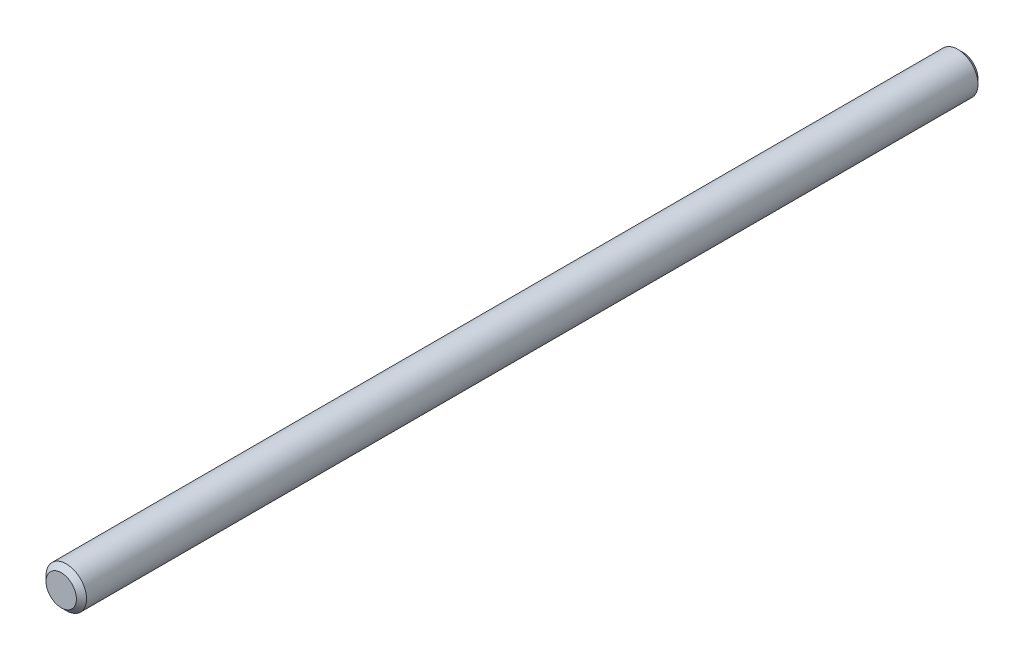
ISO-10303-21;
HEADER;
FILE_DESCRIPTION(('STEP AP214'),'2;1');
FILE_NAME('part.step','',(''),(''),'','','');
FILE_SCHEMA(('AUTOMOTIVE_DESIGN { 1 0 10303 214 1 1 1 1 }'));
ENDSEC;
DATA;
#1=APPLICATION_CONTEXT('core data for automotive mechanical design processes');
#2=APPLICATION_PROTOCOL_DEFINITION('international standard','automotive_design',2000,#1);
#3=PRODUCT_CONTEXT('',#1,'mechanical');
#4=PRODUCT('Part','Part','',(#3));
#5=PRODUCT_RELATED_PRODUCT_CATEGORY('part','',(#4));
#6=PRODUCT_DEFINITION_FORMATION('','',#4);
#7=PRODUCT_DEFINITION_CONTEXT('part definition',#1,'design');
#8=PRODUCT_DEFINITION('design','',#6,#7);
#9=PRODUCT_DEFINITION_SHAPE('','',#8);
#10=(LENGTH_UNIT() NAMED_UNIT(*) SI_UNIT(.MILLI.,.METRE.));
#11=(NAMED_UNIT(*) PLANE_ANGLE_UNIT() SI_UNIT($,.RADIAN.));
#12=(NAMED_UNIT(*) SI_UNIT($,.STERADIAN.) SOLID_ANGLE_UNIT());
#13=UNCERTAINTY_MEASURE_WITH_UNIT(LENGTH_MEASURE(1.E-05),#10,'distance_accuracy_value','');
#14=(GEOMETRIC_REPRESENTATION_CONTEXT(3) GLOBAL_UNCERTAINTY_ASSIGNED_CONTEXT((#13)) GLOBAL_UNIT_ASSIGNED_CONTEXT((#10,
#11,#12)) REPRESENTATION_CONTEXT('',''));
#15=CARTESIAN_POINT('',(0.,0.,0.));
#16=DIRECTION('',(0.,0.,1.));
#17=DIRECTION('',(1.,0.,0.));
#18=AXIS2_PLACEMENT_3D('',#15,#16,#17);
#19=CARTESIAN_POINT('',(0.,0.,44.45));
#20=DIRECTION('',(0.,0.,-1.));
#21=DIRECTION('',(-1.,0.,0.));
#22=AXIS2_PLACEMENT_3D('',#19,#20,#21);
#23=CYLINDRICAL_SURFACE('',#22,2.);
#24=CARTESIAN_POINT('',(0.,0.,-43.95));
#25=DIRECTION('',(0.,0.,1.));
#26=DIRECTION('',(1.,0.,0.));
#27=AXIS2_PLACEMENT_3D('',#24,#25,#26);
#28=CIRCLE('',#27,2.);
#29=CARTESIAN_POINT('',(2.,0.,-43.95));
#30=VERTEX_POINT('',#29);
#31=EDGE_CURVE('E59',#30,#30,#28,.T.);
#32=ORIENTED_EDGE('',*,*,#31,.T.);
#33=EDGE_LOOP('',(#32));
#34=FACE_BOUND('',#33,.T.);
#35=CARTESIAN_POINT('',(0.,0.,43.95));
#36=DIRECTION('',(0.,0.,1.));
#37=DIRECTION('',(1.,0.,0.));
#38=AXIS2_PLACEMENT_3D('',#35,#36,#37);
#39=CIRCLE('',#38,2.);
#40=CARTESIAN_POINT('',(2.,0.,43.95));
#41=VERTEX_POINT('',#40);
#42=EDGE_CURVE('E65',#41,#41,#39,.F.);
#43=ORIENTED_EDGE('',*,*,#42,.T.);
#44=EDGE_LOOP('',(#43));
#45=FACE_BOUND('',#44,.T.);
#46=ADVANCED_FACE('F44',(#34,#45),#23,.T.);
#47=CARTESIAN_POINT('',(0.,0.,44.45));
#48=DIRECTION('',(0.,0.,1.));
#49=DIRECTION('',(1.,0.,0.));
#50=AXIS2_PLACEMENT_3D('',#47,#48,#49);
#51=PLANE('',#50);
#52=CARTESIAN_POINT('',(0.,0.,44.45));
#53=DIRECTION('',(0.,0.,1.));
#54=DIRECTION('',(1.,0.,0.));
#55=AXIS2_PLACEMENT_3D('',#52,#53,#54);
#56=CIRCLE('',#55,1.50000000000002);
#57=CARTESIAN_POINT('',(1.50000000000002,0.,44.45));
#58=VERTEX_POINT('',#57);
#59=EDGE_CURVE('E11',#58,#58,#56,.T.);
#60=ORIENTED_EDGE('',*,*,#59,.T.);
#61=EDGE_LOOP('',(#60));
#62=FACE_BOUND('',#61,.T.);
#63=ADVANCED_FACE('F81',(#62),#51,.T.);
#64=CARTESIAN_POINT('',(0.,0.,-44.45));
#65=DIRECTION('',(0.,0.,1.));
#66=DIRECTION('',(1.,0.,0.));
#67=AXIS2_PLACEMENT_3D('',#64,#65,#66);
#68=PLANE('',#67);
#69=CARTESIAN_POINT('',(0.,0.,-44.45));
#70=DIRECTION('',(0.,0.,1.));
#71=DIRECTION('',(1.,0.,0.));
#72=AXIS2_PLACEMENT_3D('',#69,#70,#71);
#73=CIRCLE('',#72,1.50000000000001);
#74=CARTESIAN_POINT('',(1.50000000000001,0.,-44.45));
#75=VERTEX_POINT('',#74);
#76=EDGE_CURVE('E54',#75,#75,#73,.F.);
#77=ORIENTED_EDGE('',*,*,#76,.T.);
#78=EDGE_LOOP('',(#77));
#79=FACE_BOUND('',#78,.T.);
#80=ADVANCED_FACE('F78',(#79),#68,.F.);
#81=CARTESIAN_POINT('',(0.,0.,-43.95));
#82=DIRECTION('',(0.,0.,1.));
#83=DIRECTION('',(1.,0.,0.));
#84=AXIS2_PLACEMENT_3D('',#81,#82,#83);
#85=CONICAL_SURFACE('',#84,2.,0.785398163397426);
#86=ORIENTED_EDGE('',*,*,#76,.F.);
#87=EDGE_LOOP('',(#86));
#88=FACE_BOUND('',#87,.T.);
#89=ORIENTED_EDGE('',*,*,#31,.F.);
#90=EDGE_LOOP('',(#89));
#91=FACE_BOUND('',#90,.T.);
#92=ADVANCED_FACE('F74',(#88,#91),#85,.T.);
#93=CARTESIAN_POINT('',(0.,0.,44.45));
#94=DIRECTION('',(0.,0.,-1.));
#95=DIRECTION('',(-1.,0.,0.));
#96=AXIS2_PLACEMENT_3D('',#93,#94,#95);
#97=CONICAL_SURFACE('',#96,1.50000000000002,0.78539816339744);
#98=ORIENTED_EDGE('',*,*,#42,.F.);
#99=EDGE_LOOP('',(#98));
#100=FACE_BOUND('',#99,.T.);
#101=ORIENTED_EDGE('',*,*,#59,.F.);
#102=EDGE_LOOP('',(#101));
#103=FACE_BOUND('',#102,.T.);
#104=ADVANCED_FACE('F47',(#100,#103),#97,.T.);
#105=CLOSED_SHELL('',(#46,#63,#80,#92,#104));
#106=MANIFOLD_SOLID_BREP('B2',#105);
#107=ADVANCED_BREP_SHAPE_REPRESENTATION('',(#18,#106),#14);
#108=SHAPE_DEFINITION_REPRESENTATION(#9,#107);
ENDSEC;
END-ISO-10303-21;
